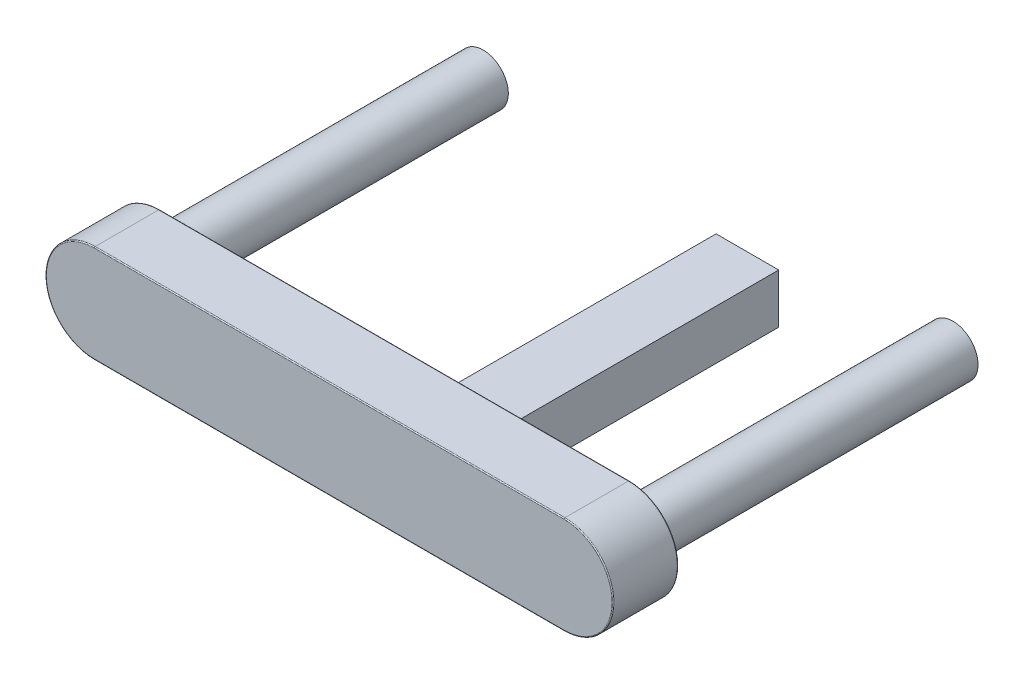
ISO-10303-21;
HEADER;
FILE_DESCRIPTION(('STEP AP214'),'2;1');
FILE_NAME('part.step','',(''),(''),'','','');
FILE_SCHEMA(('AUTOMOTIVE_DESIGN { 1 0 10303 214 1 1 1 1 }'));
ENDSEC;
DATA;
#1=APPLICATION_CONTEXT('core data for automotive mechanical design processes');
#2=APPLICATION_PROTOCOL_DEFINITION('international standard','automotive_design',2000,#1);
#3=PRODUCT_CONTEXT('',#1,'mechanical');
#4=PRODUCT('Part','Part','',(#3));
#5=PRODUCT_RELATED_PRODUCT_CATEGORY('part','',(#4));
#6=PRODUCT_DEFINITION_FORMATION('','',#4);
#7=PRODUCT_DEFINITION_CONTEXT('part definition',#1,'design');
#8=PRODUCT_DEFINITION('design','',#6,#7);
#9=PRODUCT_DEFINITION_SHAPE('','',#8);
#10=(LENGTH_UNIT() NAMED_UNIT(*) SI_UNIT(.MILLI.,.METRE.));
#11=(NAMED_UNIT(*) PLANE_ANGLE_UNIT() SI_UNIT($,.RADIAN.));
#12=(NAMED_UNIT(*) SI_UNIT($,.STERADIAN.) SOLID_ANGLE_UNIT());
#13=UNCERTAINTY_MEASURE_WITH_UNIT(LENGTH_MEASURE(1.E-05),#10,'distance_accuracy_value','');
#14=(GEOMETRIC_REPRESENTATION_CONTEXT(3) GLOBAL_UNCERTAINTY_ASSIGNED_CONTEXT((#13)) GLOBAL_UNIT_ASSIGNED_CONTEXT((#10,
#11,#12)) REPRESENTATION_CONTEXT('',''));
#15=CARTESIAN_POINT('',(0.,0.,0.));
#16=DIRECTION('',(0.,0.,1.));
#17=DIRECTION('',(1.,0.,0.));
#18=AXIS2_PLACEMENT_3D('',#15,#16,#17);
#19=CARTESIAN_POINT('',(36.,0.,5.));
#20=DIRECTION('',(0.,0.,1.));
#21=DIRECTION('',(1.,0.,0.));
#22=AXIS2_PLACEMENT_3D('',#19,#20,#21);
#23=PLANE('',#22);
#24=CARTESIAN_POINT('',(-36.,0.,5.));
#25=DIRECTION('',(0.,0.,1.));
#26=DIRECTION('',(1.,0.,0.));
#27=AXIS2_PLACEMENT_3D('',#24,#25,#26);
#28=CIRCLE('',#27,7.35000000000009);
#29=CARTESIAN_POINT('',(-35.9999988682833,7.35,5.));
#30=VERTEX_POINT('',#29);
#31=CARTESIAN_POINT('',(-35.9999988452009,-7.35,5.));
#32=VERTEX_POINT('',#31);
#33=EDGE_CURVE('E339',#30,#32,#28,.T.);
#34=ORIENTED_EDGE('',*,*,#33,.T.);
#35=DIRECTION('',(1.,0.,0.));
#36=VECTOR('',#35,1.);
#37=CARTESIAN_POINT('',(35.9999988451871,-7.35,5.));
#38=LINE('',#37,#36);
#39=CARTESIAN_POINT('',(35.9999988451871,-7.35,5.));
#40=VERTEX_POINT('',#39);
#41=EDGE_CURVE('E342',#32,#40,#38,.T.);
#42=ORIENTED_EDGE('',*,*,#41,.T.);
#43=CARTESIAN_POINT('',(36.,0.,5.));
#44=DIRECTION('',(0.,0.,1.));
#45=DIRECTION('',(1.,0.,0.));
#46=AXIS2_PLACEMENT_3D('',#43,#44,#45);
#47=CIRCLE('',#46,7.35000000000009);
#48=CARTESIAN_POINT('',(35.9999988452009,7.35,5.));
#49=VERTEX_POINT('',#48);
#50=EDGE_CURVE('E333',#40,#49,#47,.T.);
#51=ORIENTED_EDGE('',*,*,#50,.T.);
#52=DIRECTION('',(-1.,0.,0.));
#53=VECTOR('',#52,1.);
#54=CARTESIAN_POINT('',(-35.999998845187,7.35,5.));
#55=LINE('',#54,#53);
#56=EDGE_CURVE('E336',#49,#30,#55,.T.);
#57=ORIENTED_EDGE('',*,*,#56,.T.);
#58=EDGE_LOOP('',(#34,#42,#51,#57));
#59=FACE_BOUND('',#58,.T.);
#60=ADVANCED_FACE('F49',(#59),#23,.T.);
#61=CARTESIAN_POINT('',(36.,0.,-5.));
#62=DIRECTION('',(0.,0.,1.));
#63=DIRECTION('',(1.,0.,0.));
#64=AXIS2_PLACEMENT_3D('',#61,#62,#63);
#65=PLANE('',#64);
#66=CARTESIAN_POINT('',(36.,0.,-5.));
#67=DIRECTION('',(0.,0.,1.));
#68=DIRECTION('',(1.,0.,0.));
#69=AXIS2_PLACEMENT_3D('',#66,#67,#68);
#70=CIRCLE('',#69,4.5);
#71=CARTESIAN_POINT('',(40.5,0.,-5.));
#72=VERTEX_POINT('',#71);
#73=EDGE_CURVE('E224',#72,#72,#70,.F.);
#74=ORIENTED_EDGE('',*,*,#73,.F.);
#75=EDGE_LOOP('',(#74));
#76=FACE_BOUND('',#75,.T.);
#77=CARTESIAN_POINT('',(-36.,0.,-5.));
#78=DIRECTION('',(0.,0.,1.));
#79=DIRECTION('',(1.,0.,0.));
#80=AXIS2_PLACEMENT_3D('',#77,#78,#79);
#81=CIRCLE('',#80,4.5);
#82=CARTESIAN_POINT('',(-31.5,0.,-5.));
#83=VERTEX_POINT('',#82);
#84=EDGE_CURVE('E346',#83,#83,#81,.F.);
#85=ORIENTED_EDGE('',*,*,#84,.F.);
#86=EDGE_LOOP('',(#85));
#87=FACE_BOUND('',#86,.T.);
#88=DIRECTION('',(-1.,0.,0.));
#89=VECTOR('',#88,1.);
#90=CARTESIAN_POINT('',(16.,-3.9994,-5.));
#91=LINE('',#90,#89);
#92=CARTESIAN_POINT('',(16.,-3.9994,-5.));
#93=VERTEX_POINT('',#92);
#94=CARTESIAN_POINT('',(6.,-3.9994,-5.));
#95=VERTEX_POINT('',#94);
#96=EDGE_CURVE('E253',#93,#95,#91,.T.);
#97=ORIENTED_EDGE('',*,*,#96,.F.);
#98=DIRECTION('',(0.,-1.,0.));
#99=VECTOR('',#98,1.);
#100=CARTESIAN_POINT('',(16.,4.,-5.));
#101=LINE('',#100,#99);
#102=CARTESIAN_POINT('',(16.,4.,-5.));
#103=VERTEX_POINT('',#102);
#104=EDGE_CURVE('E232',#103,#93,#101,.T.);
#105=ORIENTED_EDGE('',*,*,#104,.F.);
#106=DIRECTION('',(1.,0.,0.));
#107=VECTOR('',#106,1.);
#108=CARTESIAN_POINT('',(16.,4.,-5.));
#109=LINE('',#108,#107);
#110=CARTESIAN_POINT('',(6.,4.,-5.));
#111=VERTEX_POINT('',#110);
#112=EDGE_CURVE('E238',#111,#103,#109,.T.);
#113=ORIENTED_EDGE('',*,*,#112,.F.);
#114=DIRECTION('',(0.,1.,0.));
#115=VECTOR('',#114,1.);
#116=CARTESIAN_POINT('',(6.,4.,-5.));
#117=LINE('',#116,#115);
#118=EDGE_CURVE('E257',#95,#111,#117,.T.);
#119=ORIENTED_EDGE('',*,*,#118,.F.);
#120=EDGE_LOOP('',(#97,#105,#113,#119));
#121=FACE_BOUND('',#120,.T.);
#122=CARTESIAN_POINT('',(-36.,0.,-5.));
#123=DIRECTION('',(0.,0.,1.));
#124=DIRECTION('',(1.,0.,0.));
#125=AXIS2_PLACEMENT_3D('',#122,#123,#124);
#126=CIRCLE('',#125,7.35000000000009);
#127=CARTESIAN_POINT('',(-35.9999988682969,-7.35,-5.));
#128=VERTEX_POINT('',#127);
#129=CARTESIAN_POINT('',(-35.9999988451871,7.35,-5.));
#130=VERTEX_POINT('',#129);
#131=EDGE_CURVE('E300',#128,#130,#126,.F.);
#132=ORIENTED_EDGE('',*,*,#131,.T.);
#133=DIRECTION('',(-1.,0.,0.));
#134=VECTOR('',#133,1.);
#135=CARTESIAN_POINT('',(36.,7.35,-5.));
#136=LINE('',#135,#134);
#137=CARTESIAN_POINT('',(35.9999988452009,7.35,-5.));
#138=VERTEX_POINT('',#137);
#139=EDGE_CURVE('E303',#130,#138,#136,.F.);
#140=ORIENTED_EDGE('',*,*,#139,.T.);
#141=CARTESIAN_POINT('',(36.,0.,-5.));
#142=DIRECTION('',(0.,0.,1.));
#143=DIRECTION('',(1.,0.,0.));
#144=AXIS2_PLACEMENT_3D('',#141,#142,#143);
#145=CIRCLE('',#144,7.35000000000009);
#146=CARTESIAN_POINT('',(35.9999988451871,-7.35,-5.));
#147=VERTEX_POINT('',#146);
#148=EDGE_CURVE('E294',#138,#147,#145,.F.);
#149=ORIENTED_EDGE('',*,*,#148,.T.);
#150=DIRECTION('',(1.,0.,0.));
#151=VECTOR('',#150,1.);
#152=CARTESIAN_POINT('',(36.,-7.35,-5.));
#153=LINE('',#152,#151);
#154=EDGE_CURVE('E297',#147,#128,#153,.F.);
#155=ORIENTED_EDGE('',*,*,#154,.T.);
#156=EDGE_LOOP('',(#132,#140,#149,#155));
#157=FACE_BOUND('',#156,.T.);
#158=ADVANCED_FACE('F396',(#76,#87,#121,#157),#65,.F.);
#159=CARTESIAN_POINT('',(36.,0.,5.));
#160=DIRECTION('',(0.,0.,-1.));
#161=DIRECTION('',(-1.,0.,0.));
#162=AXIS2_PLACEMENT_3D('',#159,#160,#161);
#163=CYLINDRICAL_SURFACE('',#162,7.50000000000009);
#164=DIRECTION('',(0.,0.,-1.));
#165=VECTOR('',#164,1.);
#166=CARTESIAN_POINT('',(35.9999988451871,-7.5,5.));
#167=LINE('',#166,#165);
#168=CARTESIAN_POINT('',(35.9999988451871,-7.5,4.85));
#169=VERTEX_POINT('',#168);
#170=CARTESIAN_POINT('',(35.9999988451871,-7.5,-4.85));
#171=VERTEX_POINT('',#170);
#172=EDGE_CURVE('E277',#169,#171,#167,.T.);
#173=ORIENTED_EDGE('',*,*,#172,.T.);
#174=CARTESIAN_POINT('',(36.,0.,-4.85));
#175=DIRECTION('',(0.,0.,1.));
#176=DIRECTION('',(1.,0.,0.));
#177=AXIS2_PLACEMENT_3D('',#174,#175,#176);
#178=CIRCLE('',#177,7.50000000000009);
#179=CARTESIAN_POINT('',(35.9999988452009,7.5,-4.85));
#180=VERTEX_POINT('',#179);
#181=EDGE_CURVE('E330',#171,#180,#178,.T.);
#182=ORIENTED_EDGE('',*,*,#181,.T.);
#183=DIRECTION('',(0.,0.,-1.));
#184=VECTOR('',#183,1.);
#185=CARTESIAN_POINT('',(35.9999988452009,7.5,5.));
#186=LINE('',#185,#184);
#187=CARTESIAN_POINT('',(35.9999988452009,7.5,4.85));
#188=VERTEX_POINT('',#187);
#189=EDGE_CURVE('E290',#188,#180,#186,.T.);
#190=ORIENTED_EDGE('',*,*,#189,.F.);
#191=CARTESIAN_POINT('',(36.,0.,4.85));
#192=DIRECTION('',(0.,0.,1.));
#193=DIRECTION('',(1.,0.,0.));
#194=AXIS2_PLACEMENT_3D('',#191,#192,#193);
#195=CIRCLE('',#194,7.50000000000009);
#196=EDGE_CURVE('E327',#188,#169,#195,.F.);
#197=ORIENTED_EDGE('',*,*,#196,.T.);
#198=EDGE_LOOP('',(#173,#182,#190,#197));
#199=FACE_BOUND('',#198,.T.);
#200=ADVANCED_FACE('F402',(#199),#163,.T.);
#201=CARTESIAN_POINT('',(-35.9999988451871,7.5,5.));
#202=DIRECTION('',(0.,-1.,0.));
#203=DIRECTION('',(0.,0.,-1.));
#204=AXIS2_PLACEMENT_3D('',#201,#202,#203);
#205=PLANE('',#204);
#206=ORIENTED_EDGE('',*,*,#189,.T.);
#207=DIRECTION('',(-1.,0.,0.));
#208=VECTOR('',#207,1.);
#209=CARTESIAN_POINT('',(-35.9999988451871,7.5,-4.85));
#210=LINE('',#209,#208);
#211=CARTESIAN_POINT('',(-35.9999988451871,7.5,-4.85));
#212=VERTEX_POINT('',#211);
#213=EDGE_CURVE('E310',#180,#212,#210,.T.);
#214=ORIENTED_EDGE('',*,*,#213,.T.);
#215=DIRECTION('',(0.,0.,-1.));
#216=VECTOR('',#215,1.);
#217=CARTESIAN_POINT('',(-35.9999988451871,7.5,5.));
#218=LINE('',#217,#216);
#219=CARTESIAN_POINT('',(-35.9999988451871,7.5,4.85));
#220=VERTEX_POINT('',#219);
#221=EDGE_CURVE('E286',#220,#212,#218,.T.);
#222=ORIENTED_EDGE('',*,*,#221,.F.);
#223=DIRECTION('',(-1.,0.,0.));
#224=VECTOR('',#223,1.);
#225=CARTESIAN_POINT('',(35.9999988452009,7.5,4.85));
#226=LINE('',#225,#224);
#227=EDGE_CURVE('E307',#220,#188,#226,.F.);
#228=ORIENTED_EDGE('',*,*,#227,.T.);
#229=EDGE_LOOP('',(#206,#214,#222,#228));
#230=FACE_BOUND('',#229,.T.);
#231=ADVANCED_FACE('F417',(#230),#205,.F.);
#232=CARTESIAN_POINT('',(-36.,0.,5.));
#233=DIRECTION('',(0.,0.,-1.));
#234=DIRECTION('',(-1.,0.,0.));
#235=AXIS2_PLACEMENT_3D('',#232,#233,#234);
#236=CYLINDRICAL_SURFACE('',#235,7.50000000000009);
#237=ORIENTED_EDGE('',*,*,#221,.T.);
#238=CARTESIAN_POINT('',(-36.,0.,-4.85));
#239=DIRECTION('',(0.,0.,1.));
#240=DIRECTION('',(1.,0.,0.));
#241=AXIS2_PLACEMENT_3D('',#238,#239,#240);
#242=CIRCLE('',#241,7.50000000000009);
#243=CARTESIAN_POINT('',(-35.9999988452009,-7.5,-4.85));
#244=VERTEX_POINT('',#243);
#245=EDGE_CURVE('E317',#212,#244,#242,.T.);
#246=ORIENTED_EDGE('',*,*,#245,.T.);
#247=DIRECTION('',(0.,0.,-1.));
#248=VECTOR('',#247,1.);
#249=CARTESIAN_POINT('',(-35.9999988452009,-7.5,5.));
#250=LINE('',#249,#248);
#251=CARTESIAN_POINT('',(-35.9999988452009,-7.5,4.85));
#252=VERTEX_POINT('',#251);
#253=EDGE_CURVE('E281',#252,#244,#250,.T.);
#254=ORIENTED_EDGE('',*,*,#253,.F.);
#255=CARTESIAN_POINT('',(-36.,0.,4.85));
#256=DIRECTION('',(0.,0.,1.));
#257=DIRECTION('',(1.,0.,0.));
#258=AXIS2_PLACEMENT_3D('',#255,#256,#257);
#259=CIRCLE('',#258,7.50000000000009);
#260=EDGE_CURVE('E314',#252,#220,#259,.F.);
#261=ORIENTED_EDGE('',*,*,#260,.T.);
#262=EDGE_LOOP('',(#237,#246,#254,#261));
#263=FACE_BOUND('',#262,.T.);
#264=ADVANCED_FACE('F413',(#263),#236,.T.);
#265=CARTESIAN_POINT('',(-35.9999988452009,-7.5,5.));
#266=DIRECTION('',(0.,1.,0.));
#267=DIRECTION('',(0.,0.,1.));
#268=AXIS2_PLACEMENT_3D('',#265,#266,#267);
#269=PLANE('',#268);
#270=ORIENTED_EDGE('',*,*,#253,.T.);
#271=DIRECTION('',(1.,0.,0.));
#272=VECTOR('',#271,1.);
#273=CARTESIAN_POINT('',(-35.9999988452009,-7.5,-4.85));
#274=LINE('',#273,#272);
#275=EDGE_CURVE('E324',#244,#171,#274,.T.);
#276=ORIENTED_EDGE('',*,*,#275,.T.);
#277=ORIENTED_EDGE('',*,*,#172,.F.);
#278=DIRECTION('',(1.,0.,0.));
#279=VECTOR('',#278,1.);
#280=CARTESIAN_POINT('',(-35.9999988452009,-7.5,4.85));
#281=LINE('',#280,#279);
#282=EDGE_CURVE('E320',#169,#252,#281,.F.);
#283=ORIENTED_EDGE('',*,*,#282,.T.);
#284=EDGE_LOOP('',(#270,#276,#277,#283));
#285=FACE_BOUND('',#284,.T.);
#286=ADVANCED_FACE('F409',(#285),#269,.F.);
#287=CARTESIAN_POINT('',(-35.9999988452009,-7.35,-4.85));
#288=DIRECTION('',(1.,0.,0.));
#289=DIRECTION('',(0.,0.,-1.));
#290=AXIS2_PLACEMENT_3D('',#287,#288,#289);
#291=CYLINDRICAL_SURFACE('',#290,0.15);
#292=CARTESIAN_POINT('',(-35.9999988682969,-7.35,-4.85));
#293=DIRECTION('',(-0.999999999999988,-1.53973223060431E-07,0.));
#294=DIRECTION('',(1.53973223060431E-07,-0.999999999999988,0.));
#295=AXIS2_PLACEMENT_3D('',#292,#293,#294);
#296=CIRCLE('',#295,0.15);
#297=EDGE_CURVE('E354',#128,#244,#296,.T.);
#298=ORIENTED_EDGE('',*,*,#297,.F.);
#299=ORIENTED_EDGE('',*,*,#154,.F.);
#300=CARTESIAN_POINT('',(35.9999988451871,-7.35,-4.85));
#301=DIRECTION('',(1.,0.,0.));
#302=DIRECTION('',(0.,0.,-1.));
#303=AXIS2_PLACEMENT_3D('',#300,#301,#302);
#304=CIRCLE('',#303,0.15);
#305=EDGE_CURVE('E282',#171,#147,#304,.T.);
#306=ORIENTED_EDGE('',*,*,#305,.F.);
#307=ORIENTED_EDGE('',*,*,#275,.F.);
#308=EDGE_LOOP('',(#298,#299,#306,#307));
#309=FACE_BOUND('',#308,.T.);
#310=ADVANCED_FACE('F412',(#309),#291,.T.);
#311=CARTESIAN_POINT('',(36.,0.,-4.85));
#312=DIRECTION('',(0.,0.,1.));
#313=DIRECTION('',(1.,0.,0.));
#314=AXIS2_PLACEMENT_3D('',#311,#312,#313);
#315=TOROIDAL_SURFACE('',#314,7.35000000000009,0.15);
#316=ORIENTED_EDGE('',*,*,#305,.T.);
#317=ORIENTED_EDGE('',*,*,#148,.F.);
#318=CARTESIAN_POINT('',(35.9999988682969,7.35,-4.85));
#319=DIRECTION('',(-0.999999999999976,-1.53973223060431E-07,1.53973223060434E-07));
#320=DIRECTION('',(1.53973223060436E-07,0.,0.999999999999988));
#321=AXIS2_PLACEMENT_3D('',#318,#319,#320);
#322=CIRCLE('',#321,0.15);
#323=EDGE_CURVE('E350',#180,#138,#322,.T.);
#324=ORIENTED_EDGE('',*,*,#323,.F.);
#325=ORIENTED_EDGE('',*,*,#181,.F.);
#326=EDGE_LOOP('',(#316,#317,#324,#325));
#327=FACE_BOUND('',#326,.T.);
#328=ADVANCED_FACE('F432',(#327),#315,.T.);
#329=CARTESIAN_POINT('',(-36.,0.,-4.85));
#330=DIRECTION('',(0.,0.,1.));
#331=DIRECTION('',(1.,0.,0.));
#332=AXIS2_PLACEMENT_3D('',#329,#330,#331);
#333=TOROIDAL_SURFACE('',#332,7.35000000000009,0.15);
#334=ORIENTED_EDGE('',*,*,#297,.T.);
#335=ORIENTED_EDGE('',*,*,#245,.F.);
#336=CARTESIAN_POINT('',(-35.9999988451871,7.35,-4.85));
#337=DIRECTION('',(1.,0.,0.));
#338=DIRECTION('',(0.,0.,-1.));
#339=AXIS2_PLACEMENT_3D('',#336,#337,#338);
#340=CIRCLE('',#339,0.15);
#341=EDGE_CURVE('E347',#130,#212,#340,.T.);
#342=ORIENTED_EDGE('',*,*,#341,.F.);
#343=ORIENTED_EDGE('',*,*,#131,.F.);
#344=EDGE_LOOP('',(#334,#335,#342,#343));
#345=FACE_BOUND('',#344,.T.);
#346=ADVANCED_FACE('F428',(#345),#333,.T.);
#347=CARTESIAN_POINT('',(-35.9999988451871,7.35,-4.85));
#348=DIRECTION('',(-1.,0.,0.));
#349=DIRECTION('',(0.,0.,1.));
#350=AXIS2_PLACEMENT_3D('',#347,#348,#349);
#351=CYLINDRICAL_SURFACE('',#350,0.15);
#352=ORIENTED_EDGE('',*,*,#323,.T.);
#353=ORIENTED_EDGE('',*,*,#139,.F.);
#354=ORIENTED_EDGE('',*,*,#341,.T.);
#355=ORIENTED_EDGE('',*,*,#213,.F.);
#356=EDGE_LOOP('',(#352,#353,#354,#355));
#357=FACE_BOUND('',#356,.T.);
#358=ADVANCED_FACE('F425',(#357),#351,.T.);
#359=CARTESIAN_POINT('',(36.,7.35,4.85));
#360=DIRECTION('',(1.,0.,0.));
#361=DIRECTION('',(0.,0.,-1.));
#362=AXIS2_PLACEMENT_3D('',#359,#360,#361);
#363=CYLINDRICAL_SURFACE('',#362,0.15);
#364=CARTESIAN_POINT('',(35.9999988452009,7.35,4.85));
#365=DIRECTION('',(1.,0.,0.));
#366=DIRECTION('',(0.,0.,-1.));
#367=AXIS2_PLACEMENT_3D('',#364,#365,#366);
#368=CIRCLE('',#367,0.15);
#369=EDGE_CURVE('E366',#188,#49,#368,.T.);
#370=ORIENTED_EDGE('',*,*,#369,.F.);
#371=ORIENTED_EDGE('',*,*,#227,.F.);
#372=CARTESIAN_POINT('',(-35.9999988682833,7.35,4.85));
#373=DIRECTION('',(-0.999999999999988,1.53975073432139E-07,0.));
#374=DIRECTION('',(-1.53975073432139E-07,-0.999999999999988,0.));
#375=AXIS2_PLACEMENT_3D('',#372,#373,#374);
#376=CIRCLE('',#375,0.15);
#377=EDGE_CURVE('E351',#30,#220,#376,.T.);
#378=ORIENTED_EDGE('',*,*,#377,.F.);
#379=ORIENTED_EDGE('',*,*,#56,.F.);
#380=EDGE_LOOP('',(#370,#371,#378,#379));
#381=FACE_BOUND('',#380,.T.);
#382=ADVANCED_FACE('F51',(#381),#363,.T.);
#383=CARTESIAN_POINT('',(-36.,0.,4.85));
#384=DIRECTION('',(0.,0.,1.));
#385=DIRECTION('',(1.,0.,0.));
#386=AXIS2_PLACEMENT_3D('',#383,#384,#385);
#387=TOROIDAL_SURFACE('',#386,7.35000000000009,0.15);
#388=ORIENTED_EDGE('',*,*,#377,.T.);
#389=ORIENTED_EDGE('',*,*,#260,.F.);
#390=CARTESIAN_POINT('',(-35.9999988452009,-7.35,4.85));
#391=DIRECTION('',(1.,0.,0.));
#392=DIRECTION('',(0.,0.,-1.));
#393=AXIS2_PLACEMENT_3D('',#390,#391,#392);
#394=CIRCLE('',#393,0.15);
#395=EDGE_CURVE('E363',#32,#252,#394,.T.);
#396=ORIENTED_EDGE('',*,*,#395,.F.);
#397=ORIENTED_EDGE('',*,*,#33,.F.);
#398=EDGE_LOOP('',(#388,#389,#396,#397));
#399=FACE_BOUND('',#398,.T.);
#400=ADVANCED_FACE('F446',(#399),#387,.T.);
#401=CARTESIAN_POINT('',(36.,0.,4.85));
#402=DIRECTION('',(0.,0.,1.));
#403=DIRECTION('',(1.,0.,0.));
#404=AXIS2_PLACEMENT_3D('',#401,#402,#403);
#405=TOROIDAL_SURFACE('',#404,7.35000000000009,0.15);
#406=ORIENTED_EDGE('',*,*,#369,.T.);
#407=ORIENTED_EDGE('',*,*,#50,.F.);
#408=CARTESIAN_POINT('',(35.9999988682833,-7.35,4.85));
#409=DIRECTION('',(-0.999999999999976,1.53975073432139E-07,-1.5397507343214E-07));
#410=DIRECTION('',(-1.53975073432142E-07,0.,0.999999999999988));
#411=AXIS2_PLACEMENT_3D('',#408,#409,#410);
#412=CIRCLE('',#411,0.15);
#413=EDGE_CURVE('E267',#169,#40,#412,.T.);
#414=ORIENTED_EDGE('',*,*,#413,.F.);
#415=ORIENTED_EDGE('',*,*,#196,.F.);
#416=EDGE_LOOP('',(#406,#407,#414,#415));
#417=FACE_BOUND('',#416,.T.);
#418=ADVANCED_FACE('F443',(#417),#405,.T.);
#419=CARTESIAN_POINT('',(36.,-7.35,4.85));
#420=DIRECTION('',(-1.,0.,0.));
#421=DIRECTION('',(0.,0.,1.));
#422=AXIS2_PLACEMENT_3D('',#419,#420,#421);
#423=CYLINDRICAL_SURFACE('',#422,0.15);
#424=ORIENTED_EDGE('',*,*,#395,.T.);
#425=ORIENTED_EDGE('',*,*,#282,.F.);
#426=ORIENTED_EDGE('',*,*,#413,.T.);
#427=ORIENTED_EDGE('',*,*,#41,.F.);
#428=EDGE_LOOP('',(#424,#425,#426,#427));
#429=FACE_BOUND('',#428,.T.);
#430=ADVANCED_FACE('F440',(#429),#423,.T.);
#431=CARTESIAN_POINT('',(16.,4.,-2.));
#432=DIRECTION('',(1.,0.,0.));
#433=DIRECTION('',(0.,0.,-1.));
#434=AXIS2_PLACEMENT_3D('',#431,#432,#433);
#435=PLANE('',#434);
#436=ORIENTED_EDGE('',*,*,#104,.T.);
#437=DIRECTION('',(0.,0.,-1.));
#438=VECTOR('',#437,1.);
#439=CARTESIAN_POINT('',(16.,-3.9994,-2.));
#440=LINE('',#439,#438);
#441=CARTESIAN_POINT('',(16.,-3.9994,-2.));
#442=VERTEX_POINT('',#441);
#443=EDGE_CURVE('E250',#442,#93,#440,.T.);
#444=ORIENTED_EDGE('',*,*,#443,.F.);
#445=DIRECTION('',(0.,-1.,0.));
#446=VECTOR('',#445,1.);
#447=CARTESIAN_POINT('',(16.,4.,-2.));
#448=LINE('',#447,#446);
#449=CARTESIAN_POINT('',(16.,4.,-2.));
#450=VERTEX_POINT('',#449);
#451=EDGE_CURVE('E233',#450,#442,#448,.T.);
#452=ORIENTED_EDGE('',*,*,#451,.F.);
#453=DIRECTION('',(0.,0.,-1.));
#454=VECTOR('',#453,1.);
#455=CARTESIAN_POINT('',(16.,4.,-2.));
#456=LINE('',#455,#454);
#457=EDGE_CURVE('E264',#450,#103,#456,.T.);
#458=ORIENTED_EDGE('',*,*,#457,.T.);
#459=EDGE_LOOP('',(#436,#444,#452,#458));
#460=FACE_BOUND('',#459,.T.);
#461=ADVANCED_FACE('F406',(#460),#435,.F.);
#462=CARTESIAN_POINT('',(16.,4.,-2.));
#463=DIRECTION('',(0.,1.,0.));
#464=DIRECTION('',(0.,0.,1.));
#465=AXIS2_PLACEMENT_3D('',#462,#463,#464);
#466=PLANE('',#465);
#467=ORIENTED_EDGE('',*,*,#112,.T.);
#468=ORIENTED_EDGE('',*,*,#457,.F.);
#469=DIRECTION('',(1.,0.,0.));
#470=VECTOR('',#469,1.);
#471=CARTESIAN_POINT('',(16.,4.,-2.));
#472=LINE('',#471,#470);
#473=CARTESIAN_POINT('',(6.,4.,-2.));
#474=VERTEX_POINT('',#473);
#475=EDGE_CURVE('E246',#474,#450,#472,.T.);
#476=ORIENTED_EDGE('',*,*,#475,.F.);
#477=DIRECTION('',(0.,0.,-1.));
#478=VECTOR('',#477,1.);
#479=CARTESIAN_POINT('',(6.,4.,-2.));
#480=LINE('',#479,#478);
#481=EDGE_CURVE('E268',#474,#111,#480,.T.);
#482=ORIENTED_EDGE('',*,*,#481,.T.);
#483=EDGE_LOOP('',(#467,#468,#476,#482));
#484=FACE_BOUND('',#483,.T.);
#485=ADVANCED_FACE('F687',(#484),#466,.F.);
#486=CARTESIAN_POINT('',(6.,4.,-2.));
#487=DIRECTION('',(-1.,0.,0.));
#488=DIRECTION('',(0.,0.,1.));
#489=AXIS2_PLACEMENT_3D('',#486,#487,#488);
#490=PLANE('',#489);
#491=ORIENTED_EDGE('',*,*,#118,.T.);
#492=ORIENTED_EDGE('',*,*,#481,.F.);
#493=DIRECTION('',(0.,1.,0.));
#494=VECTOR('',#493,1.);
#495=CARTESIAN_POINT('',(6.,4.,-2.));
#496=LINE('',#495,#494);
#497=CARTESIAN_POINT('',(6.,-3.9994,-2.));
#498=VERTEX_POINT('',#497);
#499=EDGE_CURVE('E242',#498,#474,#496,.T.);
#500=ORIENTED_EDGE('',*,*,#499,.F.);
#501=DIRECTION('',(0.,0.,-1.));
#502=VECTOR('',#501,1.);
#503=CARTESIAN_POINT('',(6.,-3.9994,-2.));
#504=LINE('',#503,#502);
#505=EDGE_CURVE('E271',#498,#95,#504,.T.);
#506=ORIENTED_EDGE('',*,*,#505,.T.);
#507=EDGE_LOOP('',(#491,#492,#500,#506));
#508=FACE_BOUND('',#507,.T.);
#509=ADVANCED_FACE('F679',(#508),#490,.F.);
#510=CARTESIAN_POINT('',(16.,-3.9994,-2.));
#511=DIRECTION('',(0.,-1.,0.));
#512=DIRECTION('',(0.,0.,-1.));
#513=AXIS2_PLACEMENT_3D('',#510,#511,#512);
#514=PLANE('',#513);
#515=ORIENTED_EDGE('',*,*,#96,.T.);
#516=ORIENTED_EDGE('',*,*,#505,.F.);
#517=DIRECTION('',(-1.,0.,0.));
#518=VECTOR('',#517,1.);
#519=CARTESIAN_POINT('',(16.,-3.9994,-2.));
#520=LINE('',#519,#518);
#521=EDGE_CURVE('E237',#442,#498,#520,.T.);
#522=ORIENTED_EDGE('',*,*,#521,.F.);
#523=ORIENTED_EDGE('',*,*,#443,.T.);
#524=EDGE_LOOP('',(#515,#516,#522,#523));
#525=FACE_BOUND('',#524,.T.);
#526=ADVANCED_FACE('F546',(#525),#514,.F.);
#527=CARTESIAN_POINT('',(0.,0.,-2.));
#528=DIRECTION('',(0.,0.,-1.));
#529=DIRECTION('',(-1.,0.,0.));
#530=AXIS2_PLACEMENT_3D('',#527,#528,#529);
#531=PLANE('',#530);
#532=DIRECTION('',(-1.,0.,0.));
#533=VECTOR('',#532,1.);
#534=CARTESIAN_POINT('',(0.,-3.7994,-2.));
#535=LINE('',#534,#533);
#536=CARTESIAN_POINT('',(15.8,-3.7994,-2.));
#537=VERTEX_POINT('',#536);
#538=CARTESIAN_POINT('',(6.2,-3.7994,-2.));
#539=VERTEX_POINT('',#538);
#540=EDGE_CURVE('E11',#537,#539,#535,.T.);
#541=ORIENTED_EDGE('',*,*,#540,.F.);
#542=DIRECTION('',(0.,-1.,0.));
#543=VECTOR('',#542,1.);
#544=CARTESIAN_POINT('',(15.8,0.,-2.));
#545=LINE('',#544,#543);
#546=CARTESIAN_POINT('',(15.8,3.8,-2.));
#547=VERTEX_POINT('',#546);
#548=EDGE_CURVE('E165',#547,#537,#545,.T.);
#549=ORIENTED_EDGE('',*,*,#548,.F.);
#550=DIRECTION('',(1.,0.,0.));
#551=VECTOR('',#550,1.);
#552=CARTESIAN_POINT('',(0.,3.8,-2.));
#553=LINE('',#552,#551);
#554=CARTESIAN_POINT('',(6.2,3.8,-2.));
#555=VERTEX_POINT('',#554);
#556=EDGE_CURVE('E68',#555,#547,#553,.T.);
#557=ORIENTED_EDGE('',*,*,#556,.F.);
#558=DIRECTION('',(0.,1.,0.));
#559=VECTOR('',#558,1.);
#560=CARTESIAN_POINT('',(6.2,0.,-2.));
#561=LINE('',#560,#559);
#562=EDGE_CURVE('E58',#539,#555,#561,.T.);
#563=ORIENTED_EDGE('',*,*,#562,.F.);
#564=EDGE_LOOP('',(#541,#549,#557,#563));
#565=FACE_BOUND('',#564,.T.);
#566=ORIENTED_EDGE('',*,*,#451,.T.);
#567=ORIENTED_EDGE('',*,*,#521,.T.);
#568=ORIENTED_EDGE('',*,*,#499,.T.);
#569=ORIENTED_EDGE('',*,*,#475,.T.);
#570=EDGE_LOOP('',(#566,#567,#568,#569));
#571=FACE_BOUND('',#570,.T.);
#572=ADVANCED_FACE('F541',(#565,#571),#531,.T.);
#573=CARTESIAN_POINT('',(-36.,0.,-5.1));
#574=DIRECTION('',(0.,0.,1.));
#575=DIRECTION('',(1.,0.,0.));
#576=AXIS2_PLACEMENT_3D('',#573,#574,#575);
#577=CYLINDRICAL_SURFACE('',#576,4.5);
#578=CARTESIAN_POINT('',(-36.,0.,-5.1));
#579=DIRECTION('',(0.,0.,-1.));
#580=DIRECTION('',(-1.,0.,0.));
#581=AXIS2_PLACEMENT_3D('',#578,#579,#580);
#582=CIRCLE('',#581,4.5);
#583=CARTESIAN_POINT('',(-40.5,0.,-5.1));
#584=VERTEX_POINT('',#583);
#585=EDGE_CURVE('E228',#584,#584,#582,.T.);
#586=ORIENTED_EDGE('',*,*,#585,.F.);
#587=EDGE_LOOP('',(#586));
#588=FACE_BOUND('',#587,.T.);
#589=ORIENTED_EDGE('',*,*,#84,.T.);
#590=EDGE_LOOP('',(#589));
#591=FACE_BOUND('',#590,.T.);
#592=ADVANCED_FACE('F545',(#588,#591),#577,.T.);
#593=CARTESIAN_POINT('',(-36.,0.,-5.1));
#594=DIRECTION('',(0.,0.,-1.));
#595=DIRECTION('',(-1.,0.,0.));
#596=AXIS2_PLACEMENT_3D('',#593,#594,#595);
#597=PLANE('',#596);
#598=CARTESIAN_POINT('',(-36.,0.,-5.1));
#599=DIRECTION('',(0.,0.,-1.));
#600=DIRECTION('',(-1.,0.,0.));
#601=AXIS2_PLACEMENT_3D('',#598,#599,#600);
#602=CIRCLE('',#601,3.85);
#603=CARTESIAN_POINT('',(-39.85,0.,-5.1));
#604=VERTEX_POINT('',#603);
#605=EDGE_CURVE('E208',#604,#604,#602,.T.);
#606=ORIENTED_EDGE('',*,*,#605,.F.);
#607=EDGE_LOOP('',(#606));
#608=FACE_BOUND('',#607,.T.);
#609=ORIENTED_EDGE('',*,*,#585,.T.);
#610=EDGE_LOOP('',(#609));
#611=FACE_BOUND('',#610,.T.);
#612=ADVANCED_FACE('F656',(#608,#611),#597,.T.);
#613=CARTESIAN_POINT('',(36.,0.,-5.1));
#614=DIRECTION('',(0.,0.,1.));
#615=DIRECTION('',(1.,0.,0.));
#616=AXIS2_PLACEMENT_3D('',#613,#614,#615);
#617=CYLINDRICAL_SURFACE('',#616,4.5);
#618=CARTESIAN_POINT('',(36.,0.,-5.1));
#619=DIRECTION('',(0.,0.,-1.));
#620=DIRECTION('',(-1.,0.,0.));
#621=AXIS2_PLACEMENT_3D('',#618,#619,#620);
#622=CIRCLE('',#621,4.5);
#623=CARTESIAN_POINT('',(31.5,0.,-5.1));
#624=VERTEX_POINT('',#623);
#625=EDGE_CURVE('E220',#624,#624,#622,.T.);
#626=ORIENTED_EDGE('',*,*,#625,.F.);
#627=EDGE_LOOP('',(#626));
#628=FACE_BOUND('',#627,.T.);
#629=ORIENTED_EDGE('',*,*,#73,.T.);
#630=EDGE_LOOP('',(#629));
#631=FACE_BOUND('',#630,.T.);
#632=ADVANCED_FACE('F647',(#628,#631),#617,.T.);
#633=CARTESIAN_POINT('',(36.,0.,-5.1));
#634=DIRECTION('',(0.,0.,-1.));
#635=DIRECTION('',(-1.,0.,0.));
#636=AXIS2_PLACEMENT_3D('',#633,#634,#635);
#637=PLANE('',#636);
#638=CARTESIAN_POINT('',(36.,0.,-5.1));
#639=DIRECTION('',(0.,0.,-1.));
#640=DIRECTION('',(-1.,0.,0.));
#641=AXIS2_PLACEMENT_3D('',#638,#639,#640);
#642=CIRCLE('',#641,3.85);
#643=CARTESIAN_POINT('',(32.15,0.,-5.1));
#644=VERTEX_POINT('',#643);
#645=EDGE_CURVE('E212',#644,#644,#642,.T.);
#646=ORIENTED_EDGE('',*,*,#645,.F.);
#647=EDGE_LOOP('',(#646));
#648=FACE_BOUND('',#647,.T.);
#649=ORIENTED_EDGE('',*,*,#625,.T.);
#650=EDGE_LOOP('',(#649));
#651=FACE_BOUND('',#650,.T.);
#652=ADVANCED_FACE('F638',(#648,#651),#637,.T.);
#653=CARTESIAN_POINT('',(36.,0.,-54.6));
#654=DIRECTION('',(0.,0.,1.));
#655=DIRECTION('',(1.,0.,0.));
#656=AXIS2_PLACEMENT_3D('',#653,#654,#655);
#657=CYLINDRICAL_SURFACE('',#656,3.85);
#658=CARTESIAN_POINT('',(36.,0.,-54.6));
#659=DIRECTION('',(0.,0.,-1.));
#660=DIRECTION('',(-1.,0.,0.));
#661=AXIS2_PLACEMENT_3D('',#658,#659,#660);
#662=CIRCLE('',#661,3.85);
#663=CARTESIAN_POINT('',(32.15,0.,-54.6));
#664=VERTEX_POINT('',#663);
#665=EDGE_CURVE('E216',#664,#664,#662,.T.);
#666=ORIENTED_EDGE('',*,*,#665,.F.);
#667=EDGE_LOOP('',(#666));
#668=FACE_BOUND('',#667,.T.);
#669=ORIENTED_EDGE('',*,*,#645,.T.);
#670=EDGE_LOOP('',(#669));
#671=FACE_BOUND('',#670,.T.);
#672=ADVANCED_FACE('F629',(#668,#671),#657,.T.);
#673=CARTESIAN_POINT('',(36.,0.,-54.6));
#674=DIRECTION('',(0.,0.,-1.));
#675=DIRECTION('',(-1.,0.,0.));
#676=AXIS2_PLACEMENT_3D('',#673,#674,#675);
#677=PLANE('',#676);
#678=ORIENTED_EDGE('',*,*,#665,.T.);
#679=EDGE_LOOP('',(#678));
#680=FACE_BOUND('',#679,.T.);
#681=ADVANCED_FACE('F620',(#680),#677,.T.);
#682=CARTESIAN_POINT('',(-36.,0.,-54.6));
#683=DIRECTION('',(0.,0.,1.));
#684=DIRECTION('',(1.,0.,0.));
#685=AXIS2_PLACEMENT_3D('',#682,#683,#684);
#686=CYLINDRICAL_SURFACE('',#685,3.85);
#687=CARTESIAN_POINT('',(-36.,0.,-54.6));
#688=DIRECTION('',(0.,0.,-1.));
#689=DIRECTION('',(-1.,0.,0.));
#690=AXIS2_PLACEMENT_3D('',#687,#688,#689);
#691=CIRCLE('',#690,3.85);
#692=CARTESIAN_POINT('',(-39.85,0.,-54.6));
#693=VERTEX_POINT('',#692);
#694=EDGE_CURVE('E201',#693,#693,#691,.T.);
#695=ORIENTED_EDGE('',*,*,#694,.F.);
#696=EDGE_LOOP('',(#695));
#697=FACE_BOUND('',#696,.T.);
#698=ORIENTED_EDGE('',*,*,#605,.T.);
#699=EDGE_LOOP('',(#698));
#700=FACE_BOUND('',#699,.T.);
#701=ADVANCED_FACE('F612',(#697,#700),#686,.T.);
#702=CARTESIAN_POINT('',(-36.,0.,-54.6));
#703=DIRECTION('',(0.,0.,-1.));
#704=DIRECTION('',(-1.,0.,0.));
#705=AXIS2_PLACEMENT_3D('',#702,#703,#704);
#706=PLANE('',#705);
#707=ORIENTED_EDGE('',*,*,#694,.T.);
#708=EDGE_LOOP('',(#707));
#709=FACE_BOUND('',#708,.T.);
#710=ADVANCED_FACE('F538',(#709),#706,.T.);
#711=CARTESIAN_POINT('',(6.2,-3.7994,-48.1));
#712=DIRECTION('',(0.,-1.,0.));
#713=DIRECTION('',(0.,0.,-1.));
#714=AXIS2_PLACEMENT_3D('',#711,#712,#713);
#715=PLANE('',#714);
#716=DIRECTION('',(0.,0.,1.));
#717=VECTOR('',#716,1.);
#718=CARTESIAN_POINT('',(15.8,-3.7994,-48.1));
#719=LINE('',#718,#717);
#720=CARTESIAN_POINT('',(15.8,-3.7994,-48.1));
#721=VERTEX_POINT('',#720);
#722=EDGE_CURVE('E160',#721,#537,#719,.T.);
#723=ORIENTED_EDGE('',*,*,#722,.T.);
#724=ORIENTED_EDGE('',*,*,#540,.T.);
#725=DIRECTION('',(0.,0.,1.));
#726=VECTOR('',#725,1.);
#727=CARTESIAN_POINT('',(6.2,-3.7994,-48.1));
#728=LINE('',#727,#726);
#729=CARTESIAN_POINT('',(6.2,-3.7994,-48.1));
#730=VERTEX_POINT('',#729);
#731=EDGE_CURVE('E185',#730,#539,#728,.T.);
#732=ORIENTED_EDGE('',*,*,#731,.F.);
#733=DIRECTION('',(1.,0.,0.));
#734=VECTOR('',#733,1.);
#735=CARTESIAN_POINT('',(6.2,-3.7994,-48.1));
#736=LINE('',#735,#734);
#737=EDGE_CURVE('E177',#730,#721,#736,.T.);
#738=ORIENTED_EDGE('',*,*,#737,.T.);
#739=EDGE_LOOP('',(#723,#724,#732,#738));
#740=FACE_BOUND('',#739,.T.);
#741=ADVANCED_FACE('F183',(#740),#715,.T.);
#742=CARTESIAN_POINT('',(6.2,3.8,-48.1));
#743=DIRECTION('',(-1.,0.,0.));
#744=DIRECTION('',(0.,0.,1.));
#745=AXIS2_PLACEMENT_3D('',#742,#743,#744);
#746=PLANE('',#745);
#747=ORIENTED_EDGE('',*,*,#731,.T.);
#748=ORIENTED_EDGE('',*,*,#562,.T.);
#749=DIRECTION('',(0.,0.,1.));
#750=VECTOR('',#749,1.);
#751=CARTESIAN_POINT('',(6.2,3.8,-48.1));
#752=LINE('',#751,#750);
#753=CARTESIAN_POINT('',(6.2,3.8,-48.1));
#754=VERTEX_POINT('',#753);
#755=EDGE_CURVE('E202',#754,#555,#752,.T.);
#756=ORIENTED_EDGE('',*,*,#755,.F.);
#757=DIRECTION('',(0.,-1.,0.));
#758=VECTOR('',#757,1.);
#759=CARTESIAN_POINT('',(6.2,3.8,-48.1));
#760=LINE('',#759,#758);
#761=EDGE_CURVE('E170',#754,#730,#760,.T.);
#762=ORIENTED_EDGE('',*,*,#761,.T.);
#763=EDGE_LOOP('',(#747,#748,#756,#762));
#764=FACE_BOUND('',#763,.T.);
#765=ADVANCED_FACE('F384',(#764),#746,.T.);
#766=CARTESIAN_POINT('',(15.8,3.8,-48.1));
#767=DIRECTION('',(0.,1.,0.));
#768=DIRECTION('',(0.,0.,1.));
#769=AXIS2_PLACEMENT_3D('',#766,#767,#768);
#770=PLANE('',#769);
#771=ORIENTED_EDGE('',*,*,#755,.T.);
#772=ORIENTED_EDGE('',*,*,#556,.T.);
#773=DIRECTION('',(0.,0.,1.));
#774=VECTOR('',#773,1.);
#775=CARTESIAN_POINT('',(15.8,3.8,-48.1));
#776=LINE('',#775,#774);
#777=CARTESIAN_POINT('',(15.8,3.8,-48.1));
#778=VERTEX_POINT('',#777);
#779=EDGE_CURVE('E169',#778,#547,#776,.T.);
#780=ORIENTED_EDGE('',*,*,#779,.F.);
#781=DIRECTION('',(-1.,0.,0.));
#782=VECTOR('',#781,1.);
#783=CARTESIAN_POINT('',(15.8,3.8,-48.1));
#784=LINE('',#783,#782);
#785=EDGE_CURVE('E180',#778,#754,#784,.T.);
#786=ORIENTED_EDGE('',*,*,#785,.T.);
#787=EDGE_LOOP('',(#771,#772,#780,#786));
#788=FACE_BOUND('',#787,.T.);
#789=ADVANCED_FACE('F386',(#788),#770,.T.);
#790=CARTESIAN_POINT('',(15.8,-3.7994,-48.1));
#791=DIRECTION('',(1.,0.,0.));
#792=DIRECTION('',(0.,0.,-1.));
#793=AXIS2_PLACEMENT_3D('',#790,#791,#792);
#794=PLANE('',#793);
#795=ORIENTED_EDGE('',*,*,#779,.T.);
#796=ORIENTED_EDGE('',*,*,#548,.T.);
#797=ORIENTED_EDGE('',*,*,#722,.F.);
#798=DIRECTION('',(0.,1.,0.));
#799=VECTOR('',#798,1.);
#800=CARTESIAN_POINT('',(15.8,-3.7994,-48.1));
#801=LINE('',#800,#799);
#802=EDGE_CURVE('E164',#721,#778,#801,.T.);
#803=ORIENTED_EDGE('',*,*,#802,.T.);
#804=EDGE_LOOP('',(#795,#796,#797,#803));
#805=FACE_BOUND('',#804,.T.);
#806=ADVANCED_FACE('F163',(#805),#794,.T.);
#807=CARTESIAN_POINT('',(0.,0.,-48.1));
#808=DIRECTION('',(0.,0.,1.));
#809=DIRECTION('',(1.,0.,0.));
#810=AXIS2_PLACEMENT_3D('',#807,#808,#809);
#811=PLANE('',#810);
#812=CARTESIAN_POINT('',(11.,0.00030000000000082,-48.1));
#813=DIRECTION('',(0.,0.,-1.));
#814=DIRECTION('',(-1.,0.,0.));
#815=AXIS2_PLACEMENT_3D('',#812,#813,#814);
#816=CIRCLE('',#815,1.75);
#817=CARTESIAN_POINT('',(9.25,0.00030000000000082,-48.1));
#818=VERTEX_POINT('',#817);
#819=EDGE_CURVE('E191',#818,#818,#816,.T.);
#820=ORIENTED_EDGE('',*,*,#819,.F.);
#821=EDGE_LOOP('',(#820));
#822=FACE_BOUND('',#821,.T.);
#823=ORIENTED_EDGE('',*,*,#737,.F.);
#824=ORIENTED_EDGE('',*,*,#761,.F.);
#825=ORIENTED_EDGE('',*,*,#785,.F.);
#826=ORIENTED_EDGE('',*,*,#802,.F.);
#827=EDGE_LOOP('',(#823,#824,#825,#826));
#828=FACE_BOUND('',#827,.T.);
#829=ADVANCED_FACE('F175',(#822,#828),#811,.F.);
#830=CARTESIAN_POINT('',(11.,0.00030000000000082,-38.1));
#831=DIRECTION('',(0.,0.,-1.));
#832=DIRECTION('',(-1.,0.,0.));
#833=AXIS2_PLACEMENT_3D('',#830,#831,#832);
#834=CYLINDRICAL_SURFACE('',#833,1.75);
#835=CARTESIAN_POINT('',(11.,0.00030000000000082,-38.1));
#836=DIRECTION('',(0.,0.,-1.));
#837=DIRECTION('',(-1.,0.,0.));
#838=AXIS2_PLACEMENT_3D('',#835,#836,#837);
#839=CIRCLE('',#838,1.75);
#840=CARTESIAN_POINT('',(9.25,0.00030000000000082,-38.1));
#841=VERTEX_POINT('',#840);
#842=EDGE_CURVE('E187',#841,#841,#839,.T.);
#843=ORIENTED_EDGE('',*,*,#842,.F.);
#844=EDGE_LOOP('',(#843));
#845=FACE_BOUND('',#844,.T.);
#846=ORIENTED_EDGE('',*,*,#819,.T.);
#847=EDGE_LOOP('',(#846));
#848=FACE_BOUND('',#847,.T.);
#849=ADVANCED_FACE('F580',(#845,#848),#834,.F.);
#850=CARTESIAN_POINT('',(11.,0.00030000000000082,-38.1));
#851=DIRECTION('',(0.,0.,-1.));
#852=DIRECTION('',(-1.,0.,0.));
#853=AXIS2_PLACEMENT_3D('',#850,#851,#852);
#854=PLANE('',#853);
#855=ORIENTED_EDGE('',*,*,#842,.T.);
#856=EDGE_LOOP('',(#855));
#857=FACE_BOUND('',#856,.T.);
#858=ADVANCED_FACE('F590',(#857),#854,.T.);
#859=CLOSED_SHELL('',(#60,#158,#200,#231,#264,#286,#310,#328,#346,#358,#382,#400,#418,#430,#461,
#485,#509,#526,#572,#592,#612,#632,#652,#672,#681,#701,#710,#741,#765,#789,#806,#829,#849,#858));
#860=MANIFOLD_SOLID_BREP('B2',#859);
#861=ADVANCED_BREP_SHAPE_REPRESENTATION('',(#18,#860),#14);
#862=SHAPE_DEFINITION_REPRESENTATION(#9,#861);
ENDSEC;
END-ISO-10303-21;
